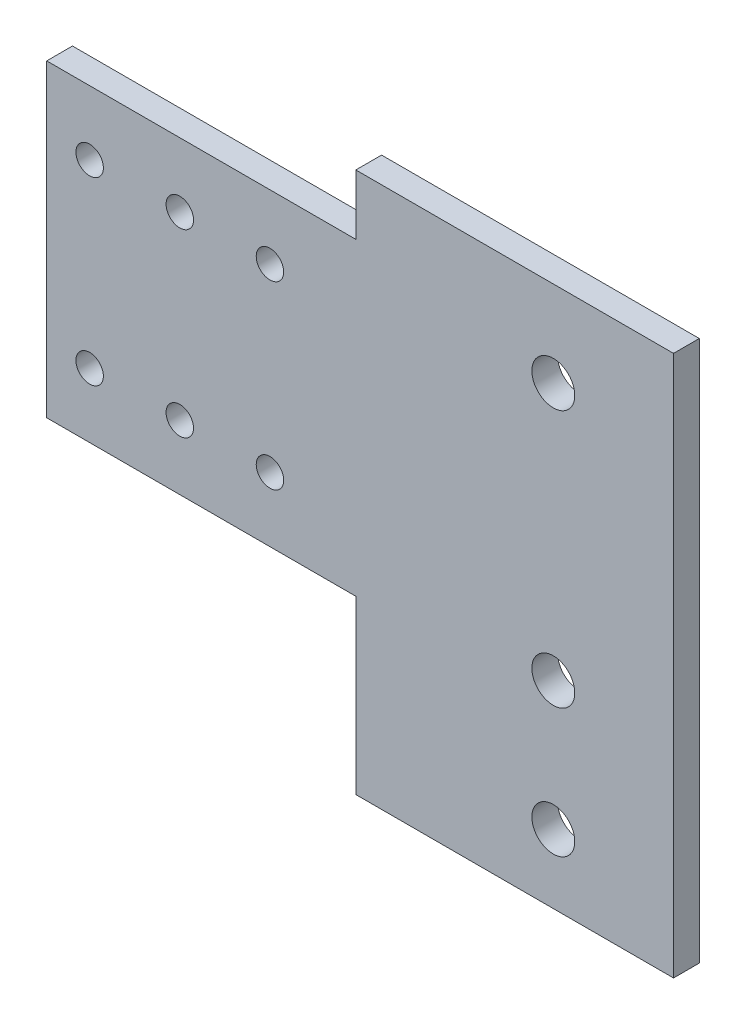
ISO-10303-21;
HEADER;
FILE_DESCRIPTION(('STEP AP214'),'2;1');
FILE_NAME('part.step','',(''),(''),'','','');
FILE_SCHEMA(('AUTOMOTIVE_DESIGN { 1 0 10303 214 1 1 1 1 }'));
ENDSEC;
DATA;
#1=APPLICATION_CONTEXT('core data for automotive mechanical design processes');
#2=APPLICATION_PROTOCOL_DEFINITION('international standard','automotive_design',2000,#1);
#3=PRODUCT_CONTEXT('',#1,'mechanical');
#4=PRODUCT('Part','Part','',(#3));
#5=PRODUCT_RELATED_PRODUCT_CATEGORY('part','',(#4));
#6=PRODUCT_DEFINITION_FORMATION('','',#4);
#7=PRODUCT_DEFINITION_CONTEXT('part definition',#1,'design');
#8=PRODUCT_DEFINITION('design','',#6,#7);
#9=PRODUCT_DEFINITION_SHAPE('','',#8);
#10=(LENGTH_UNIT() NAMED_UNIT(*) SI_UNIT(.MILLI.,.METRE.));
#11=(NAMED_UNIT(*) PLANE_ANGLE_UNIT() SI_UNIT($,.RADIAN.));
#12=(NAMED_UNIT(*) SI_UNIT($,.STERADIAN.) SOLID_ANGLE_UNIT());
#13=UNCERTAINTY_MEASURE_WITH_UNIT(LENGTH_MEASURE(1.E-05),#10,'distance_accuracy_value','');
#14=(GEOMETRIC_REPRESENTATION_CONTEXT(3) GLOBAL_UNCERTAINTY_ASSIGNED_CONTEXT((#13)) GLOBAL_UNIT_ASSIGNED_CONTEXT((#10,
#11,#12)) REPRESENTATION_CONTEXT('',''));
#15=CARTESIAN_POINT('',(0.,0.,0.));
#16=DIRECTION('',(0.,0.,1.));
#17=DIRECTION('',(1.,0.,0.));
#18=AXIS2_PLACEMENT_3D('',#15,#16,#17);
#19=CARTESIAN_POINT('',(0.,-36.,3.));
#20=DIRECTION('',(1.,0.,0.));
#21=DIRECTION('',(0.,0.,-1.));
#22=AXIS2_PLACEMENT_3D('',#19,#20,#21);
#23=PLANE('',#22);
#24=DIRECTION('',(0.,-1.,0.));
#25=VECTOR('',#24,1.);
#26=CARTESIAN_POINT('',(0.,-36.,0.));
#27=LINE('',#26,#25);
#28=CARTESIAN_POINT('',(0.,0.,0.));
#29=VERTEX_POINT('',#28);
#30=CARTESIAN_POINT('',(0.,-36.,0.));
#31=VERTEX_POINT('',#30);
#32=EDGE_CURVE('E136',#29,#31,#27,.T.);
#33=ORIENTED_EDGE('',*,*,#32,.T.);
#34=DIRECTION('',(0.,0.,-1.));
#35=VECTOR('',#34,1.);
#36=CARTESIAN_POINT('',(0.,-36.,3.));
#37=LINE('',#36,#35);
#38=CARTESIAN_POINT('',(0.,-36.,3.));
#39=VERTEX_POINT('',#38);
#40=EDGE_CURVE('E11',#39,#31,#37,.T.);
#41=ORIENTED_EDGE('',*,*,#40,.F.);
#42=DIRECTION('',(0.,-1.,0.));
#43=VECTOR('',#42,1.);
#44=CARTESIAN_POINT('',(0.,-36.,3.));
#45=LINE('',#44,#43);
#46=CARTESIAN_POINT('',(0.,0.,3.));
#47=VERTEX_POINT('',#46);
#48=EDGE_CURVE('E150',#47,#39,#45,.T.);
#49=ORIENTED_EDGE('',*,*,#48,.F.);
#50=DIRECTION('',(0.,0.,-1.));
#51=VECTOR('',#50,1.);
#52=CARTESIAN_POINT('',(0.,0.,3.));
#53=LINE('',#52,#51);
#54=EDGE_CURVE('E135',#47,#29,#53,.T.);
#55=ORIENTED_EDGE('',*,*,#54,.T.);
#56=EDGE_LOOP('',(#33,#41,#49,#55));
#57=FACE_BOUND('',#56,.T.);
#58=ADVANCED_FACE('F35',(#57),#23,.F.);
#59=CARTESIAN_POINT('',(36.,-36.,3.));
#60=DIRECTION('',(0.,1.,0.));
#61=DIRECTION('',(-1.,0.,0.));
#62=AXIS2_PLACEMENT_3D('',#59,#60,#61);
#63=PLANE('',#62);
#64=DIRECTION('',(1.,0.,0.));
#65=VECTOR('',#64,1.);
#66=CARTESIAN_POINT('',(36.,-36.,0.));
#67=LINE('',#66,#65);
#68=CARTESIAN_POINT('',(36.,-36.,0.));
#69=VERTEX_POINT('',#68);
#70=EDGE_CURVE('E139',#31,#69,#67,.T.);
#71=ORIENTED_EDGE('',*,*,#70,.T.);
#72=DIRECTION('',(0.,0.,-1.));
#73=VECTOR('',#72,1.);
#74=CARTESIAN_POINT('',(36.,-36.,3.));
#75=LINE('',#74,#73);
#76=CARTESIAN_POINT('',(36.,-36.,3.));
#77=VERTEX_POINT('',#76);
#78=EDGE_CURVE('E42',#77,#69,#75,.T.);
#79=ORIENTED_EDGE('',*,*,#78,.F.);
#80=DIRECTION('',(1.,0.,0.));
#81=VECTOR('',#80,1.);
#82=CARTESIAN_POINT('',(36.,-36.,3.));
#83=LINE('',#82,#81);
#84=EDGE_CURVE('E93',#39,#77,#83,.T.);
#85=ORIENTED_EDGE('',*,*,#84,.F.);
#86=ORIENTED_EDGE('',*,*,#40,.T.);
#87=EDGE_LOOP('',(#71,#79,#85,#86));
#88=FACE_BOUND('',#87,.T.);
#89=ADVANCED_FACE('F229',(#88),#63,.F.);
#90=CARTESIAN_POINT('',(36.,-56.,3.));
#91=DIRECTION('',(1.,0.,0.));
#92=DIRECTION('',(0.,1.,0.));
#93=AXIS2_PLACEMENT_3D('',#90,#91,#92);
#94=PLANE('',#93);
#95=DIRECTION('',(0.,-1.,0.));
#96=VECTOR('',#95,1.);
#97=CARTESIAN_POINT('',(36.,-56.,0.));
#98=LINE('',#97,#96);
#99=CARTESIAN_POINT('',(36.,-56.,0.));
#100=VERTEX_POINT('',#99);
#101=EDGE_CURVE('E142',#69,#100,#98,.T.);
#102=ORIENTED_EDGE('',*,*,#101,.T.);
#103=DIRECTION('',(0.,0.,-1.));
#104=VECTOR('',#103,1.);
#105=CARTESIAN_POINT('',(36.,-56.,3.));
#106=LINE('',#105,#104);
#107=CARTESIAN_POINT('',(36.,-56.,3.));
#108=VERTEX_POINT('',#107);
#109=EDGE_CURVE('E125',#108,#100,#106,.T.);
#110=ORIENTED_EDGE('',*,*,#109,.F.);
#111=DIRECTION('',(0.,-1.,0.));
#112=VECTOR('',#111,1.);
#113=CARTESIAN_POINT('',(36.,-56.,3.));
#114=LINE('',#113,#112);
#115=EDGE_CURVE('E112',#77,#108,#114,.T.);
#116=ORIENTED_EDGE('',*,*,#115,.F.);
#117=ORIENTED_EDGE('',*,*,#78,.T.);
#118=EDGE_LOOP('',(#102,#110,#116,#117));
#119=FACE_BOUND('',#118,.T.);
#120=ADVANCED_FACE('F156',(#119),#94,.F.);
#121=CARTESIAN_POINT('',(73.,-56.,3.));
#122=DIRECTION('',(0.,1.,0.));
#123=DIRECTION('',(0.,0.,1.));
#124=AXIS2_PLACEMENT_3D('',#121,#122,#123);
#125=PLANE('',#124);
#126=DIRECTION('',(1.,0.,0.));
#127=VECTOR('',#126,1.);
#128=CARTESIAN_POINT('',(73.,-56.,0.));
#129=LINE('',#128,#127);
#130=CARTESIAN_POINT('',(73.,-56.,0.));
#131=VERTEX_POINT('',#130);
#132=EDGE_CURVE('E121',#100,#131,#129,.T.);
#133=ORIENTED_EDGE('',*,*,#132,.T.);
#134=DIRECTION('',(0.,0.,-1.));
#135=VECTOR('',#134,1.);
#136=CARTESIAN_POINT('',(73.,-56.,3.));
#137=LINE('',#136,#135);
#138=CARTESIAN_POINT('',(73.,-56.,3.));
#139=VERTEX_POINT('',#138);
#140=EDGE_CURVE('E118',#139,#131,#137,.T.);
#141=ORIENTED_EDGE('',*,*,#140,.F.);
#142=DIRECTION('',(1.,0.,0.));
#143=VECTOR('',#142,1.);
#144=CARTESIAN_POINT('',(73.,-56.,3.));
#145=LINE('',#144,#143);
#146=EDGE_CURVE('E104',#108,#139,#145,.T.);
#147=ORIENTED_EDGE('',*,*,#146,.F.);
#148=ORIENTED_EDGE('',*,*,#109,.T.);
#149=EDGE_LOOP('',(#133,#141,#147,#148));
#150=FACE_BOUND('',#149,.T.);
#151=ADVANCED_FACE('F119',(#150),#125,.F.);
#152=CARTESIAN_POINT('',(73.,20.,3.));
#153=DIRECTION('',(-1.,0.,0.));
#154=DIRECTION('',(0.,0.,1.));
#155=AXIS2_PLACEMENT_3D('',#152,#153,#154);
#156=PLANE('',#155);
#157=DIRECTION('',(0.,1.,0.));
#158=VECTOR('',#157,1.);
#159=CARTESIAN_POINT('',(73.,20.,0.));
#160=LINE('',#159,#158);
#161=CARTESIAN_POINT('',(73.,7.,0.));
#162=VERTEX_POINT('',#161);
#163=EDGE_CURVE('E145',#131,#162,#160,.T.);
#164=ORIENTED_EDGE('',*,*,#163,.T.);
#165=DIRECTION('',(0.,0.,1.));
#166=VECTOR('',#165,1.);
#167=CARTESIAN_POINT('',(73.,7.,0.));
#168=LINE('',#167,#166);
#169=CARTESIAN_POINT('',(73.,7.,3.));
#170=VERTEX_POINT('',#169);
#171=EDGE_CURVE('E49',#162,#170,#168,.T.);
#172=ORIENTED_EDGE('',*,*,#171,.T.);
#173=DIRECTION('',(0.,1.,0.));
#174=VECTOR('',#173,1.);
#175=CARTESIAN_POINT('',(73.,20.,3.));
#176=LINE('',#175,#174);
#177=EDGE_CURVE('E110',#139,#170,#176,.T.);
#178=ORIENTED_EDGE('',*,*,#177,.F.);
#179=ORIENTED_EDGE('',*,*,#140,.T.);
#180=EDGE_LOOP('',(#164,#172,#178,#179));
#181=FACE_BOUND('',#180,.T.);
#182=ADVANCED_FACE('F128',(#181),#156,.F.);
#183=CARTESIAN_POINT('',(36.,0.,3.));
#184=DIRECTION('',(1.,0.,0.));
#185=DIRECTION('',(0.,0.,-1.));
#186=AXIS2_PLACEMENT_3D('',#183,#184,#185);
#187=PLANE('',#186);
#188=DIRECTION('',(0.,-1.,0.));
#189=VECTOR('',#188,1.);
#190=CARTESIAN_POINT('',(36.,0.,3.));
#191=LINE('',#190,#189);
#192=CARTESIAN_POINT('',(36.,7.,3.));
#193=VERTEX_POINT('',#192);
#194=CARTESIAN_POINT('',(36.,0.,3.));
#195=VERTEX_POINT('',#194);
#196=EDGE_CURVE('E129',#193,#195,#191,.T.);
#197=ORIENTED_EDGE('',*,*,#196,.F.);
#198=DIRECTION('',(0.,0.,1.));
#199=VECTOR('',#198,1.);
#200=CARTESIAN_POINT('',(36.,7.,0.));
#201=LINE('',#200,#199);
#202=CARTESIAN_POINT('',(36.,7.,0.));
#203=VERTEX_POINT('',#202);
#204=EDGE_CURVE('E167',#203,#193,#201,.T.);
#205=ORIENTED_EDGE('',*,*,#204,.F.);
#206=DIRECTION('',(0.,-1.,0.));
#207=VECTOR('',#206,1.);
#208=CARTESIAN_POINT('',(36.,0.,0.));
#209=LINE('',#208,#207);
#210=CARTESIAN_POINT('',(36.,0.,0.));
#211=VERTEX_POINT('',#210);
#212=EDGE_CURVE('E147',#203,#211,#209,.T.);
#213=ORIENTED_EDGE('',*,*,#212,.T.);
#214=DIRECTION('',(0.,0.,-1.));
#215=VECTOR('',#214,1.);
#216=CARTESIAN_POINT('',(36.,0.,3.));
#217=LINE('',#216,#215);
#218=EDGE_CURVE('E126',#195,#211,#217,.T.);
#219=ORIENTED_EDGE('',*,*,#218,.F.);
#220=EDGE_LOOP('',(#197,#205,#213,#219));
#221=FACE_BOUND('',#220,.T.);
#222=ADVANCED_FACE('F241',(#221),#187,.F.);
#223=CARTESIAN_POINT('',(0.,0.,3.));
#224=DIRECTION('',(0.,-1.,0.));
#225=DIRECTION('',(0.,0.,-1.));
#226=AXIS2_PLACEMENT_3D('',#223,#224,#225);
#227=PLANE('',#226);
#228=DIRECTION('',(-1.,0.,0.));
#229=VECTOR('',#228,1.);
#230=CARTESIAN_POINT('',(0.,0.,0.));
#231=LINE('',#230,#229);
#232=EDGE_CURVE('E85',#211,#29,#231,.T.);
#233=ORIENTED_EDGE('',*,*,#232,.T.);
#234=ORIENTED_EDGE('',*,*,#54,.F.);
#235=DIRECTION('',(-1.,0.,0.));
#236=VECTOR('',#235,1.);
#237=CARTESIAN_POINT('',(0.,0.,3.));
#238=LINE('',#237,#236);
#239=EDGE_CURVE('E58',#195,#47,#238,.T.);
#240=ORIENTED_EDGE('',*,*,#239,.F.);
#241=ORIENTED_EDGE('',*,*,#218,.T.);
#242=EDGE_LOOP('',(#233,#234,#240,#241));
#243=FACE_BOUND('',#242,.T.);
#244=ADVANCED_FACE('F244',(#243),#227,.F.);
#245=CARTESIAN_POINT('',(0.,0.,3.));
#246=DIRECTION('',(0.,0.,-1.));
#247=DIRECTION('',(-1.,0.,0.));
#248=AXIS2_PLACEMENT_3D('',#245,#246,#247);
#249=PLANE('',#248);
#250=CARTESIAN_POINT('',(59.0000000000001,-3.00000000000027,3.));
#251=DIRECTION('',(0.,0.,-1.));
#252=DIRECTION('',(-1.,0.,0.));
#253=AXIS2_PLACEMENT_3D('',#250,#251,#252);
#254=CIRCLE('',#253,2.5);
#255=CARTESIAN_POINT('',(56.5000000000001,-3.00000000000027,3.));
#256=VERTEX_POINT('',#255);
#257=EDGE_CURVE('E173',#256,#256,#254,.T.);
#258=ORIENTED_EDGE('',*,*,#257,.T.);
#259=EDGE_LOOP('',(#258));
#260=FACE_BOUND('',#259,.T.);
#261=CARTESIAN_POINT('',(58.9999999999999,-33.0000000000002,3.));
#262=DIRECTION('',(0.,0.,-1.));
#263=DIRECTION('',(-1.,0.,0.));
#264=AXIS2_PLACEMENT_3D('',#261,#262,#263);
#265=CIRCLE('',#264,2.5);
#266=CARTESIAN_POINT('',(56.4999999999999,-33.0000000000002,3.));
#267=VERTEX_POINT('',#266);
#268=EDGE_CURVE('E179',#267,#267,#265,.T.);
#269=ORIENTED_EDGE('',*,*,#268,.T.);
#270=EDGE_LOOP('',(#269));
#271=FACE_BOUND('',#270,.T.);
#272=CARTESIAN_POINT('',(58.9999999999999,-48.0000000000002,3.));
#273=DIRECTION('',(0.,0.,-1.));
#274=DIRECTION('',(-1.,0.,0.));
#275=AXIS2_PLACEMENT_3D('',#272,#273,#274);
#276=CIRCLE('',#275,2.5);
#277=CARTESIAN_POINT('',(56.4999999999999,-48.0000000000002,3.));
#278=VERTEX_POINT('',#277);
#279=EDGE_CURVE('E186',#278,#278,#276,.T.);
#280=ORIENTED_EDGE('',*,*,#279,.T.);
#281=EDGE_LOOP('',(#280));
#282=FACE_BOUND('',#281,.T.);
#283=CARTESIAN_POINT('',(15.5,-28.5,3.));
#284=DIRECTION('',(0.,0.,-1.));
#285=DIRECTION('',(-1.,0.,0.));
#286=AXIS2_PLACEMENT_3D('',#283,#284,#285);
#287=CIRCLE('',#286,1.6);
#288=CARTESIAN_POINT('',(13.9,-28.5,3.));
#289=VERTEX_POINT('',#288);
#290=EDGE_CURVE('E204',#289,#289,#287,.T.);
#291=ORIENTED_EDGE('',*,*,#290,.T.);
#292=EDGE_LOOP('',(#291));
#293=FACE_BOUND('',#292,.T.);
#294=CARTESIAN_POINT('',(5.,-28.5,3.));
#295=DIRECTION('',(0.,0.,-1.));
#296=DIRECTION('',(-1.,0.,0.));
#297=AXIS2_PLACEMENT_3D('',#294,#295,#296);
#298=CIRCLE('',#297,1.6);
#299=CARTESIAN_POINT('',(3.4,-28.5,3.));
#300=VERTEX_POINT('',#299);
#301=EDGE_CURVE('E197',#300,#300,#298,.T.);
#302=ORIENTED_EDGE('',*,*,#301,.T.);
#303=EDGE_LOOP('',(#302));
#304=FACE_BOUND('',#303,.T.);
#305=CARTESIAN_POINT('',(5.,-7.5,3.));
#306=DIRECTION('',(0.,0.,-1.));
#307=DIRECTION('',(-1.,0.,0.));
#308=AXIS2_PLACEMENT_3D('',#305,#306,#307);
#309=CIRCLE('',#308,1.6);
#310=CARTESIAN_POINT('',(3.4,-7.5,3.));
#311=VERTEX_POINT('',#310);
#312=EDGE_CURVE('E216',#311,#311,#309,.T.);
#313=ORIENTED_EDGE('',*,*,#312,.T.);
#314=EDGE_LOOP('',(#313));
#315=FACE_BOUND('',#314,.T.);
#316=CARTESIAN_POINT('',(26.,-28.5,3.));
#317=DIRECTION('',(0.,0.,-1.));
#318=DIRECTION('',(-1.,0.,0.));
#319=AXIS2_PLACEMENT_3D('',#316,#317,#318);
#320=CIRCLE('',#319,1.6);
#321=CARTESIAN_POINT('',(24.4,-28.5,3.));
#322=VERTEX_POINT('',#321);
#323=EDGE_CURVE('E209',#322,#322,#320,.T.);
#324=ORIENTED_EDGE('',*,*,#323,.T.);
#325=EDGE_LOOP('',(#324));
#326=FACE_BOUND('',#325,.T.);
#327=CARTESIAN_POINT('',(15.5,-7.5,3.));
#328=DIRECTION('',(0.,0.,-1.));
#329=DIRECTION('',(-1.,0.,0.));
#330=AXIS2_PLACEMENT_3D('',#327,#328,#329);
#331=CIRCLE('',#330,1.6);
#332=CARTESIAN_POINT('',(13.9,-7.5,3.));
#333=VERTEX_POINT('',#332);
#334=EDGE_CURVE('E191',#333,#333,#331,.T.);
#335=ORIENTED_EDGE('',*,*,#334,.T.);
#336=EDGE_LOOP('',(#335));
#337=FACE_BOUND('',#336,.T.);
#338=CARTESIAN_POINT('',(26.,-7.5,3.));
#339=DIRECTION('',(0.,0.,-1.));
#340=DIRECTION('',(-1.,0.,0.));
#341=AXIS2_PLACEMENT_3D('',#338,#339,#340);
#342=CIRCLE('',#341,1.6);
#343=CARTESIAN_POINT('',(24.4,-7.5,3.));
#344=VERTEX_POINT('',#343);
#345=EDGE_CURVE('E140',#344,#344,#342,.T.);
#346=ORIENTED_EDGE('',*,*,#345,.T.);
#347=EDGE_LOOP('',(#346));
#348=FACE_BOUND('',#347,.T.);
#349=ORIENTED_EDGE('',*,*,#177,.T.);
#350=DIRECTION('',(1.,0.,0.));
#351=VECTOR('',#350,1.);
#352=CARTESIAN_POINT('',(36.,7.,3.));
#353=LINE('',#352,#351);
#354=EDGE_CURVE('E165',#193,#170,#353,.T.);
#355=ORIENTED_EDGE('',*,*,#354,.F.);
#356=ORIENTED_EDGE('',*,*,#196,.T.);
#357=ORIENTED_EDGE('',*,*,#239,.T.);
#358=ORIENTED_EDGE('',*,*,#48,.T.);
#359=ORIENTED_EDGE('',*,*,#84,.T.);
#360=ORIENTED_EDGE('',*,*,#115,.T.);
#361=ORIENTED_EDGE('',*,*,#146,.T.);
#362=EDGE_LOOP('',(#349,#355,#356,#357,#358,#359,#360,#361));
#363=FACE_BOUND('',#362,.T.);
#364=ADVANCED_FACE('F106',(#260,#271,#282,#293,#304,#315,#326,#337,#348,#363),#249,.F.);
#365=CARTESIAN_POINT('',(0.,0.,0.));
#366=DIRECTION('',(0.,0.,-1.));
#367=DIRECTION('',(-1.,0.,0.));
#368=AXIS2_PLACEMENT_3D('',#365,#366,#367);
#369=PLANE('',#368);
#370=DIRECTION('',(1.,0.,0.));
#371=VECTOR('',#370,1.);
#372=CARTESIAN_POINT('',(36.,7.,0.));
#373=LINE('',#372,#371);
#374=EDGE_CURVE('E162',#203,#162,#373,.T.);
#375=ORIENTED_EDGE('',*,*,#374,.T.);
#376=ORIENTED_EDGE('',*,*,#163,.F.);
#377=ORIENTED_EDGE('',*,*,#132,.F.);
#378=ORIENTED_EDGE('',*,*,#101,.F.);
#379=ORIENTED_EDGE('',*,*,#70,.F.);
#380=ORIENTED_EDGE('',*,*,#32,.F.);
#381=ORIENTED_EDGE('',*,*,#232,.F.);
#382=ORIENTED_EDGE('',*,*,#212,.F.);
#383=EDGE_LOOP('',(#375,#376,#377,#378,#379,#380,#381,#382));
#384=FACE_BOUND('',#383,.T.);
#385=CARTESIAN_POINT('',(59.0000000000001,-3.00000000000027,0.));
#386=DIRECTION('',(0.,0.,-1.));
#387=DIRECTION('',(-1.,0.,0.));
#388=AXIS2_PLACEMENT_3D('',#385,#386,#387);
#389=CIRCLE('',#388,2.5);
#390=CARTESIAN_POINT('',(56.5000000000001,-3.00000000000027,0.));
#391=VERTEX_POINT('',#390);
#392=EDGE_CURVE('E171',#391,#391,#389,.T.);
#393=ORIENTED_EDGE('',*,*,#392,.F.);
#394=EDGE_LOOP('',(#393));
#395=FACE_BOUND('',#394,.T.);
#396=CARTESIAN_POINT('',(58.9999999999999,-33.0000000000002,0.));
#397=DIRECTION('',(0.,0.,-1.));
#398=DIRECTION('',(-1.,0.,0.));
#399=AXIS2_PLACEMENT_3D('',#396,#397,#398);
#400=CIRCLE('',#399,2.5);
#401=CARTESIAN_POINT('',(56.4999999999999,-33.0000000000002,0.));
#402=VERTEX_POINT('',#401);
#403=EDGE_CURVE('E183',#402,#402,#400,.T.);
#404=ORIENTED_EDGE('',*,*,#403,.F.);
#405=EDGE_LOOP('',(#404));
#406=FACE_BOUND('',#405,.T.);
#407=CARTESIAN_POINT('',(58.9999999999999,-48.0000000000002,0.));
#408=DIRECTION('',(0.,0.,-1.));
#409=DIRECTION('',(-1.,0.,0.));
#410=AXIS2_PLACEMENT_3D('',#407,#408,#409);
#411=CIRCLE('',#410,2.5);
#412=CARTESIAN_POINT('',(56.4999999999999,-48.0000000000002,0.));
#413=VERTEX_POINT('',#412);
#414=EDGE_CURVE('E176',#413,#413,#411,.T.);
#415=ORIENTED_EDGE('',*,*,#414,.F.);
#416=EDGE_LOOP('',(#415));
#417=FACE_BOUND('',#416,.T.);
#418=CARTESIAN_POINT('',(15.5,-28.5,0.));
#419=DIRECTION('',(0.,0.,-1.));
#420=DIRECTION('',(-1.,0.,0.));
#421=AXIS2_PLACEMENT_3D('',#418,#419,#420);
#422=CIRCLE('',#421,1.6);
#423=CARTESIAN_POINT('',(13.9,-28.5,0.));
#424=VERTEX_POINT('',#423);
#425=EDGE_CURVE('E194',#424,#424,#422,.T.);
#426=ORIENTED_EDGE('',*,*,#425,.F.);
#427=EDGE_LOOP('',(#426));
#428=FACE_BOUND('',#427,.T.);
#429=CARTESIAN_POINT('',(5.,-28.5,0.));
#430=DIRECTION('',(0.,0.,-1.));
#431=DIRECTION('',(-1.,0.,0.));
#432=AXIS2_PLACEMENT_3D('',#429,#430,#431);
#433=CIRCLE('',#432,1.6);
#434=CARTESIAN_POINT('',(3.4,-28.5,0.));
#435=VERTEX_POINT('',#434);
#436=EDGE_CURVE('E201',#435,#435,#433,.T.);
#437=ORIENTED_EDGE('',*,*,#436,.F.);
#438=EDGE_LOOP('',(#437));
#439=FACE_BOUND('',#438,.T.);
#440=CARTESIAN_POINT('',(5.,-7.5,0.));
#441=DIRECTION('',(0.,0.,-1.));
#442=DIRECTION('',(-1.,0.,0.));
#443=AXIS2_PLACEMENT_3D('',#440,#441,#442);
#444=CIRCLE('',#443,1.6);
#445=CARTESIAN_POINT('',(3.4,-7.5,0.));
#446=VERTEX_POINT('',#445);
#447=EDGE_CURVE('E200',#446,#446,#444,.T.);
#448=ORIENTED_EDGE('',*,*,#447,.F.);
#449=EDGE_LOOP('',(#448));
#450=FACE_BOUND('',#449,.T.);
#451=CARTESIAN_POINT('',(26.,-28.5,0.));
#452=DIRECTION('',(0.,0.,-1.));
#453=DIRECTION('',(-1.,0.,0.));
#454=AXIS2_PLACEMENT_3D('',#451,#452,#453);
#455=CIRCLE('',#454,1.6);
#456=CARTESIAN_POINT('',(24.4,-28.5,0.));
#457=VERTEX_POINT('',#456);
#458=EDGE_CURVE('E213',#457,#457,#455,.T.);
#459=ORIENTED_EDGE('',*,*,#458,.F.);
#460=EDGE_LOOP('',(#459));
#461=FACE_BOUND('',#460,.T.);
#462=CARTESIAN_POINT('',(15.5,-7.5,0.));
#463=DIRECTION('',(0.,0.,-1.));
#464=DIRECTION('',(-1.,0.,0.));
#465=AXIS2_PLACEMENT_3D('',#462,#463,#464);
#466=CIRCLE('',#465,1.6);
#467=CARTESIAN_POINT('',(13.9,-7.5,0.));
#468=VERTEX_POINT('',#467);
#469=EDGE_CURVE('E182',#468,#468,#466,.T.);
#470=ORIENTED_EDGE('',*,*,#469,.F.);
#471=EDGE_LOOP('',(#470));
#472=FACE_BOUND('',#471,.T.);
#473=CARTESIAN_POINT('',(26.,-7.5,0.));
#474=DIRECTION('',(0.,0.,-1.));
#475=DIRECTION('',(-1.,0.,0.));
#476=AXIS2_PLACEMENT_3D('',#473,#474,#475);
#477=CIRCLE('',#476,1.6);
#478=CARTESIAN_POINT('',(24.4,-7.5,0.));
#479=VERTEX_POINT('',#478);
#480=EDGE_CURVE('E212',#479,#479,#477,.T.);
#481=ORIENTED_EDGE('',*,*,#480,.F.);
#482=EDGE_LOOP('',(#481));
#483=FACE_BOUND('',#482,.T.);
#484=ADVANCED_FACE('F158',(#384,#395,#406,#417,#428,#439,#450,#461,#472,#483),#369,.T.);
#485=CARTESIAN_POINT('',(26.,-7.5,3.));
#486=DIRECTION('',(0.,0.,-1.));
#487=DIRECTION('',(-1.,0.,0.));
#488=AXIS2_PLACEMENT_3D('',#485,#486,#487);
#489=CYLINDRICAL_SURFACE('',#488,1.6);
#490=ORIENTED_EDGE('',*,*,#345,.F.);
#491=EDGE_LOOP('',(#490));
#492=FACE_BOUND('',#491,.T.);
#493=ORIENTED_EDGE('',*,*,#480,.T.);
#494=EDGE_LOOP('',(#493));
#495=FACE_BOUND('',#494,.T.);
#496=ADVANCED_FACE('F250',(#492,#495),#489,.F.);
#497=CARTESIAN_POINT('',(15.5,-7.5,3.));
#498=DIRECTION('',(0.,0.,-1.));
#499=DIRECTION('',(-1.,0.,0.));
#500=AXIS2_PLACEMENT_3D('',#497,#498,#499);
#501=CYLINDRICAL_SURFACE('',#500,1.6);
#502=ORIENTED_EDGE('',*,*,#334,.F.);
#503=EDGE_LOOP('',(#502));
#504=FACE_BOUND('',#503,.T.);
#505=ORIENTED_EDGE('',*,*,#469,.T.);
#506=EDGE_LOOP('',(#505));
#507=FACE_BOUND('',#506,.T.);
#508=ADVANCED_FACE('F256',(#504,#507),#501,.F.);
#509=CARTESIAN_POINT('',(26.,-28.5,3.));
#510=DIRECTION('',(0.,0.,-1.));
#511=DIRECTION('',(-1.,0.,0.));
#512=AXIS2_PLACEMENT_3D('',#509,#510,#511);
#513=CYLINDRICAL_SURFACE('',#512,1.6);
#514=ORIENTED_EDGE('',*,*,#323,.F.);
#515=EDGE_LOOP('',(#514));
#516=FACE_BOUND('',#515,.T.);
#517=ORIENTED_EDGE('',*,*,#458,.T.);
#518=EDGE_LOOP('',(#517));
#519=FACE_BOUND('',#518,.T.);
#520=ADVANCED_FACE('F262',(#516,#519),#513,.F.);
#521=CARTESIAN_POINT('',(5.,-7.5,3.));
#522=DIRECTION('',(0.,0.,-1.));
#523=DIRECTION('',(-1.,0.,0.));
#524=AXIS2_PLACEMENT_3D('',#521,#522,#523);
#525=CYLINDRICAL_SURFACE('',#524,1.6);
#526=ORIENTED_EDGE('',*,*,#312,.F.);
#527=EDGE_LOOP('',(#526));
#528=FACE_BOUND('',#527,.T.);
#529=ORIENTED_EDGE('',*,*,#447,.T.);
#530=EDGE_LOOP('',(#529));
#531=FACE_BOUND('',#530,.T.);
#532=ADVANCED_FACE('F258',(#528,#531),#525,.F.);
#533=CARTESIAN_POINT('',(5.,-28.5,3.));
#534=DIRECTION('',(0.,0.,-1.));
#535=DIRECTION('',(-1.,0.,0.));
#536=AXIS2_PLACEMENT_3D('',#533,#534,#535);
#537=CYLINDRICAL_SURFACE('',#536,1.6);
#538=ORIENTED_EDGE('',*,*,#301,.F.);
#539=EDGE_LOOP('',(#538));
#540=FACE_BOUND('',#539,.T.);
#541=ORIENTED_EDGE('',*,*,#436,.T.);
#542=EDGE_LOOP('',(#541));
#543=FACE_BOUND('',#542,.T.);
#544=ADVANCED_FACE('F261',(#540,#543),#537,.F.);
#545=CARTESIAN_POINT('',(15.5,-28.5,3.));
#546=DIRECTION('',(0.,0.,-1.));
#547=DIRECTION('',(-1.,0.,0.));
#548=AXIS2_PLACEMENT_3D('',#545,#546,#547);
#549=CYLINDRICAL_SURFACE('',#548,1.6);
#550=ORIENTED_EDGE('',*,*,#290,.F.);
#551=EDGE_LOOP('',(#550));
#552=FACE_BOUND('',#551,.T.);
#553=ORIENTED_EDGE('',*,*,#425,.T.);
#554=EDGE_LOOP('',(#553));
#555=FACE_BOUND('',#554,.T.);
#556=ADVANCED_FACE('F267',(#552,#555),#549,.F.);
#557=CARTESIAN_POINT('',(58.9999999999999,-48.0000000000002,3.));
#558=DIRECTION('',(0.,0.,-1.));
#559=DIRECTION('',(-1.,0.,0.));
#560=AXIS2_PLACEMENT_3D('',#557,#558,#559);
#561=CYLINDRICAL_SURFACE('',#560,2.5);
#562=ORIENTED_EDGE('',*,*,#279,.F.);
#563=EDGE_LOOP('',(#562));
#564=FACE_BOUND('',#563,.T.);
#565=ORIENTED_EDGE('',*,*,#414,.T.);
#566=EDGE_LOOP('',(#565));
#567=FACE_BOUND('',#566,.T.);
#568=ADVANCED_FACE('F270',(#564,#567),#561,.F.);
#569=CARTESIAN_POINT('',(58.9999999999999,-33.0000000000002,3.));
#570=DIRECTION('',(0.,0.,-1.));
#571=DIRECTION('',(-1.,0.,0.));
#572=AXIS2_PLACEMENT_3D('',#569,#570,#571);
#573=CYLINDRICAL_SURFACE('',#572,2.5);
#574=ORIENTED_EDGE('',*,*,#268,.F.);
#575=EDGE_LOOP('',(#574));
#576=FACE_BOUND('',#575,.T.);
#577=ORIENTED_EDGE('',*,*,#403,.T.);
#578=EDGE_LOOP('',(#577));
#579=FACE_BOUND('',#578,.T.);
#580=ADVANCED_FACE('F280',(#576,#579),#573,.F.);
#581=CARTESIAN_POINT('',(59.0000000000001,-3.00000000000027,3.));
#582=DIRECTION('',(0.,0.,-1.));
#583=DIRECTION('',(-1.,0.,0.));
#584=AXIS2_PLACEMENT_3D('',#581,#582,#583);
#585=CYLINDRICAL_SURFACE('',#584,2.5);
#586=ORIENTED_EDGE('',*,*,#257,.F.);
#587=EDGE_LOOP('',(#586));
#588=FACE_BOUND('',#587,.T.);
#589=ORIENTED_EDGE('',*,*,#392,.T.);
#590=EDGE_LOOP('',(#589));
#591=FACE_BOUND('',#590,.T.);
#592=ADVANCED_FACE('F284',(#588,#591),#585,.F.);
#593=CARTESIAN_POINT('',(36.,7.,0.));
#594=DIRECTION('',(0.,-1.,0.));
#595=DIRECTION('',(0.,0.,-1.));
#596=AXIS2_PLACEMENT_3D('',#593,#594,#595);
#597=PLANE('',#596);
#598=ORIENTED_EDGE('',*,*,#354,.T.);
#599=ORIENTED_EDGE('',*,*,#171,.F.);
#600=ORIENTED_EDGE('',*,*,#374,.F.);
#601=ORIENTED_EDGE('',*,*,#204,.T.);
#602=EDGE_LOOP('',(#598,#599,#600,#601));
#603=FACE_BOUND('',#602,.T.);
#604=ADVANCED_FACE('F288',(#603),#597,.F.);
#605=CLOSED_SHELL('',(#58,#89,#120,#151,#182,#222,#244,#364,#484,#496,#508,#520,#532,#544,#556,
#568,#580,#592,#604));
#606=MANIFOLD_SOLID_BREP('B2',#605);
#607=ADVANCED_BREP_SHAPE_REPRESENTATION('',(#18,#606),#14);
#608=SHAPE_DEFINITION_REPRESENTATION(#9,#607);
ENDSEC;
END-ISO-10303-21;
